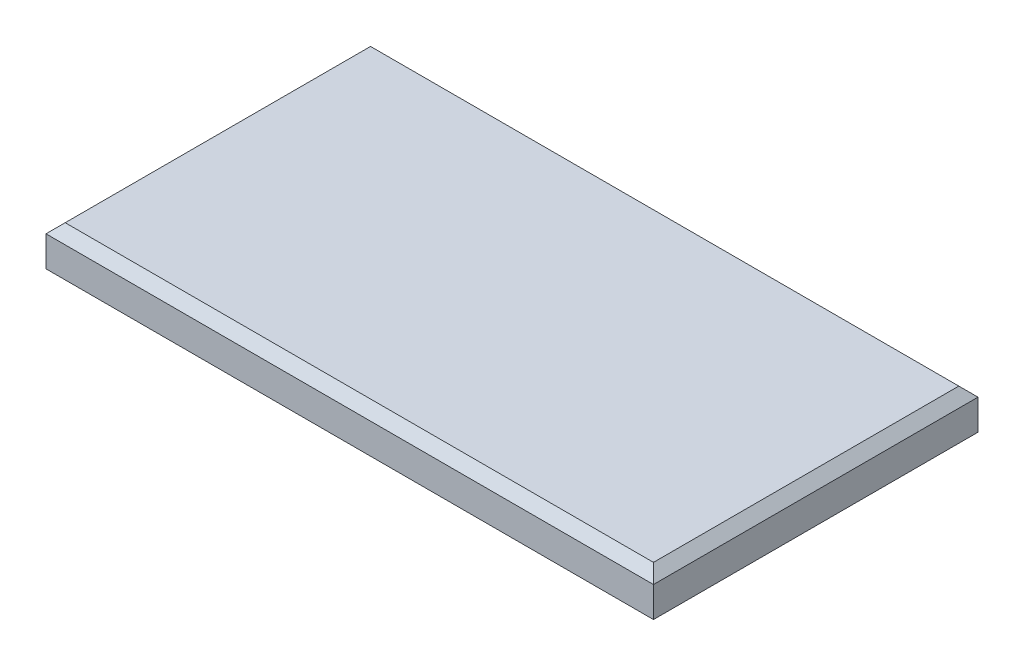
ISO-10303-21;
HEADER;
FILE_DESCRIPTION(('STEP AP214'),'2;1');
FILE_NAME('part.step','',(''),(''),'','','');
FILE_SCHEMA(('AUTOMOTIVE_DESIGN { 1 0 10303 214 1 1 1 1 }'));
ENDSEC;
DATA;
#1=APPLICATION_CONTEXT('core data for automotive mechanical design processes');
#2=APPLICATION_PROTOCOL_DEFINITION('international standard','automotive_design',2000,#1);
#3=PRODUCT_CONTEXT('',#1,'mechanical');
#4=PRODUCT('Part','Part','',(#3));
#5=PRODUCT_RELATED_PRODUCT_CATEGORY('part','',(#4));
#6=PRODUCT_DEFINITION_FORMATION('','',#4);
#7=PRODUCT_DEFINITION_CONTEXT('part definition',#1,'design');
#8=PRODUCT_DEFINITION('design','',#6,#7);
#9=PRODUCT_DEFINITION_SHAPE('','',#8);
#10=(LENGTH_UNIT() NAMED_UNIT(*) SI_UNIT(.MILLI.,.METRE.));
#11=(NAMED_UNIT(*) PLANE_ANGLE_UNIT() SI_UNIT($,.RADIAN.));
#12=(NAMED_UNIT(*) SI_UNIT($,.STERADIAN.) SOLID_ANGLE_UNIT());
#13=UNCERTAINTY_MEASURE_WITH_UNIT(LENGTH_MEASURE(1.E-05),#10,'distance_accuracy_value','');
#14=(GEOMETRIC_REPRESENTATION_CONTEXT(3) GLOBAL_UNCERTAINTY_ASSIGNED_CONTEXT((#13)) GLOBAL_UNIT_ASSIGNED_CONTEXT((#10,
#11,#12)) REPRESENTATION_CONTEXT('',''));
#15=CARTESIAN_POINT('',(0.,0.,0.));
#16=DIRECTION('',(0.,0.,1.));
#17=DIRECTION('',(1.,0.,0.));
#18=AXIS2_PLACEMENT_3D('',#15,#16,#17);
#19=CARTESIAN_POINT('',(-190.,25.,-101.5));
#20=DIRECTION('',(1.,0.,0.));
#21=DIRECTION('',(0.,0.,-1.));
#22=AXIS2_PLACEMENT_3D('',#19,#20,#21);
#23=PLANE('',#22);
#24=DIRECTION('',(0.,-1.,0.));
#25=VECTOR('',#24,1.);
#26=CARTESIAN_POINT('',(-190.,25.,101.5));
#27=LINE('',#26,#25);
#28=CARTESIAN_POINT('',(-190.,19.,101.5));
#29=VERTEX_POINT('',#28);
#30=CARTESIAN_POINT('',(-190.,0.,101.5));
#31=VERTEX_POINT('',#30);
#32=EDGE_CURVE('E87',#29,#31,#27,.T.);
#33=ORIENTED_EDGE('',*,*,#32,.F.);
#34=DIRECTION('',(0.,0.,-1.));
#35=VECTOR('',#34,1.);
#36=CARTESIAN_POINT('',(-190.,19.,-101.5));
#37=LINE('',#36,#35);
#38=CARTESIAN_POINT('',(-190.,19.,-101.5));
#39=VERTEX_POINT('',#38);
#40=EDGE_CURVE('E11',#29,#39,#37,.T.);
#41=ORIENTED_EDGE('',*,*,#40,.T.);
#42=DIRECTION('',(0.,-1.,0.));
#43=VECTOR('',#42,1.);
#44=CARTESIAN_POINT('',(-190.,25.,-101.5));
#45=LINE('',#44,#43);
#46=CARTESIAN_POINT('',(-190.,0.,-101.5));
#47=VERTEX_POINT('',#46);
#48=EDGE_CURVE('E107',#39,#47,#45,.T.);
#49=ORIENTED_EDGE('',*,*,#48,.T.);
#50=DIRECTION('',(0.,0.,1.));
#51=VECTOR('',#50,1.);
#52=CARTESIAN_POINT('',(-190.,0.,-101.5));
#53=LINE('',#52,#51);
#54=EDGE_CURVE('E102',#47,#31,#53,.T.);
#55=ORIENTED_EDGE('',*,*,#54,.T.);
#56=EDGE_LOOP('',(#33,#41,#49,#55));
#57=FACE_BOUND('',#56,.T.);
#58=ADVANCED_FACE('F34',(#57),#23,.F.);
#59=CARTESIAN_POINT('',(190.,25.,101.5));
#60=DIRECTION('',(0.,0.,-1.));
#61=DIRECTION('',(-1.,0.,0.));
#62=AXIS2_PLACEMENT_3D('',#59,#60,#61);
#63=PLANE('',#62);
#64=DIRECTION('',(0.,-1.,0.));
#65=VECTOR('',#64,1.);
#66=CARTESIAN_POINT('',(190.,25.,101.5));
#67=LINE('',#66,#65);
#68=CARTESIAN_POINT('',(190.,19.,101.5));
#69=VERTEX_POINT('',#68);
#70=CARTESIAN_POINT('',(190.,0.,101.5));
#71=VERTEX_POINT('',#70);
#72=EDGE_CURVE('E96',#69,#71,#67,.T.);
#73=ORIENTED_EDGE('',*,*,#72,.F.);
#74=DIRECTION('',(-1.,0.,0.));
#75=VECTOR('',#74,1.);
#76=CARTESIAN_POINT('',(190.,19.,101.5));
#77=LINE('',#76,#75);
#78=EDGE_CURVE('E44',#69,#29,#77,.T.);
#79=ORIENTED_EDGE('',*,*,#78,.T.);
#80=ORIENTED_EDGE('',*,*,#32,.T.);
#81=DIRECTION('',(1.,0.,0.));
#82=VECTOR('',#81,1.);
#83=CARTESIAN_POINT('',(190.,0.,101.5));
#84=LINE('',#83,#82);
#85=EDGE_CURVE('E90',#31,#71,#84,.T.);
#86=ORIENTED_EDGE('',*,*,#85,.T.);
#87=EDGE_LOOP('',(#73,#79,#80,#86));
#88=FACE_BOUND('',#87,.T.);
#89=ADVANCED_FACE('F89',(#88),#63,.F.);
#90=CARTESIAN_POINT('',(190.,25.,-101.5));
#91=DIRECTION('',(-1.,0.,0.));
#92=DIRECTION('',(0.,0.,1.));
#93=AXIS2_PLACEMENT_3D('',#90,#91,#92);
#94=PLANE('',#93);
#95=DIRECTION('',(0.,-1.,0.));
#96=VECTOR('',#95,1.);
#97=CARTESIAN_POINT('',(190.,25.,-101.5));
#98=LINE('',#97,#96);
#99=CARTESIAN_POINT('',(190.,19.,-101.5));
#100=VERTEX_POINT('',#99);
#101=CARTESIAN_POINT('',(190.,0.,-101.5));
#102=VERTEX_POINT('',#101);
#103=EDGE_CURVE('E117',#100,#102,#98,.T.);
#104=ORIENTED_EDGE('',*,*,#103,.F.);
#105=DIRECTION('',(0.,0.,1.));
#106=VECTOR('',#105,1.);
#107=CARTESIAN_POINT('',(190.,19.,-101.5));
#108=LINE('',#107,#106);
#109=EDGE_CURVE('E59',#100,#69,#108,.T.);
#110=ORIENTED_EDGE('',*,*,#109,.T.);
#111=ORIENTED_EDGE('',*,*,#72,.T.);
#112=DIRECTION('',(0.,0.,-1.));
#113=VECTOR('',#112,1.);
#114=CARTESIAN_POINT('',(190.,0.,-101.5));
#115=LINE('',#114,#113);
#116=EDGE_CURVE('E104',#71,#102,#115,.T.);
#117=ORIENTED_EDGE('',*,*,#116,.T.);
#118=EDGE_LOOP('',(#104,#110,#111,#117));
#119=FACE_BOUND('',#118,.T.);
#120=ADVANCED_FACE('F155',(#119),#94,.F.);
#121=CARTESIAN_POINT('',(190.,25.,-101.5));
#122=DIRECTION('',(0.,0.,1.));
#123=DIRECTION('',(1.,0.,0.));
#124=AXIS2_PLACEMENT_3D('',#121,#122,#123);
#125=PLANE('',#124);
#126=ORIENTED_EDGE('',*,*,#48,.F.);
#127=DIRECTION('',(1.,0.,0.));
#128=VECTOR('',#127,1.);
#129=CARTESIAN_POINT('',(190.,19.,-101.5));
#130=LINE('',#129,#128);
#131=EDGE_CURVE('E128',#39,#100,#130,.T.);
#132=ORIENTED_EDGE('',*,*,#131,.T.);
#133=ORIENTED_EDGE('',*,*,#103,.T.);
#134=DIRECTION('',(-1.,0.,0.));
#135=VECTOR('',#134,1.);
#136=CARTESIAN_POINT('',(190.,0.,-101.5));
#137=LINE('',#136,#135);
#138=EDGE_CURVE('E114',#102,#47,#137,.T.);
#139=ORIENTED_EDGE('',*,*,#138,.T.);
#140=EDGE_LOOP('',(#126,#132,#133,#139));
#141=FACE_BOUND('',#140,.T.);
#142=ADVANCED_FACE('F154',(#141),#125,.F.);
#143=CARTESIAN_POINT('',(0.,25.,0.));
#144=DIRECTION('',(0.,-1.,0.));
#145=DIRECTION('',(0.,0.,-1.));
#146=AXIS2_PLACEMENT_3D('',#143,#144,#145);
#147=PLANE('',#146);
#148=DIRECTION('',(0.,0.,-1.));
#149=VECTOR('',#148,1.);
#150=CARTESIAN_POINT('',(184.,25.,0.));
#151=LINE('',#150,#149);
#152=CARTESIAN_POINT('',(184.,25.,95.5));
#153=VERTEX_POINT('',#152);
#154=CARTESIAN_POINT('',(184.,25.,-95.5000000000001));
#155=VERTEX_POINT('',#154);
#156=EDGE_CURVE('E123',#153,#155,#151,.T.);
#157=ORIENTED_EDGE('',*,*,#156,.T.);
#158=DIRECTION('',(-1.,0.,0.));
#159=VECTOR('',#158,1.);
#160=CARTESIAN_POINT('',(0.,25.,-95.5000000000001));
#161=LINE('',#160,#159);
#162=CARTESIAN_POINT('',(-184.,25.,-95.5));
#163=VERTEX_POINT('',#162);
#164=EDGE_CURVE('E125',#155,#163,#161,.T.);
#165=ORIENTED_EDGE('',*,*,#164,.T.);
#166=DIRECTION('',(0.,0.,1.));
#167=VECTOR('',#166,1.);
#168=CARTESIAN_POINT('',(-184.,25.,0.));
#169=LINE('',#168,#167);
#170=CARTESIAN_POINT('',(-184.,25.,95.5000000000001));
#171=VERTEX_POINT('',#170);
#172=EDGE_CURVE('E95',#163,#171,#169,.T.);
#173=ORIENTED_EDGE('',*,*,#172,.T.);
#174=DIRECTION('',(1.,0.,0.));
#175=VECTOR('',#174,1.);
#176=CARTESIAN_POINT('',(0.,25.,95.5));
#177=LINE('',#176,#175);
#178=EDGE_CURVE('E121',#171,#153,#177,.T.);
#179=ORIENTED_EDGE('',*,*,#178,.T.);
#180=EDGE_LOOP('',(#157,#165,#173,#179));
#181=FACE_BOUND('',#180,.T.);
#182=ADVANCED_FACE('F147',(#181),#147,.F.);
#183=CARTESIAN_POINT('',(0.,0.,0.));
#184=DIRECTION('',(0.,-1.,0.));
#185=DIRECTION('',(0.,0.,-1.));
#186=AXIS2_PLACEMENT_3D('',#183,#184,#185);
#187=PLANE('',#186);
#188=ORIENTED_EDGE('',*,*,#54,.F.);
#189=ORIENTED_EDGE('',*,*,#138,.F.);
#190=ORIENTED_EDGE('',*,*,#116,.F.);
#191=ORIENTED_EDGE('',*,*,#85,.F.);
#192=EDGE_LOOP('',(#188,#189,#190,#191));
#193=FACE_BOUND('',#192,.T.);
#194=ADVANCED_FACE('F100',(#193),#187,.T.);
#195=CARTESIAN_POINT('',(0.,25.,95.5));
#196=DIRECTION('',(0.,-0.707106781186544,-0.707106781186551));
#197=DIRECTION('',(1.,0.,0.));
#198=AXIS2_PLACEMENT_3D('',#195,#196,#197);
#199=PLANE('',#198);
#200=DIRECTION('',(0.577350269189624,0.577350269189629,-0.577350269189624));
#201=VECTOR('',#200,1.);
#202=CARTESIAN_POINT('',(-152.166666666667,56.8333333333334,63.6666666666669));
#203=LINE('',#202,#201);
#204=EDGE_CURVE('E111',#29,#171,#203,.T.);
#205=ORIENTED_EDGE('',*,*,#204,.F.);
#206=ORIENTED_EDGE('',*,*,#78,.F.);
#207=DIRECTION('',(-0.577350269189623,0.57735026918963,-0.577350269189624));
#208=VECTOR('',#207,1.);
#209=CARTESIAN_POINT('',(122.666666666667,86.3333333333335,34.1666666666671));
#210=LINE('',#209,#208);
#211=EDGE_CURVE('E39',#153,#69,#210,.F.);
#212=ORIENTED_EDGE('',*,*,#211,.F.);
#213=ORIENTED_EDGE('',*,*,#178,.F.);
#214=EDGE_LOOP('',(#205,#206,#212,#213));
#215=FACE_BOUND('',#214,.T.);
#216=ADVANCED_FACE('F37',(#215),#199,.F.);
#217=CARTESIAN_POINT('',(184.,25.,0.));
#218=DIRECTION('',(-0.707106781186552,-0.707106781186543,0.));
#219=DIRECTION('',(0.,0.,-1.));
#220=AXIS2_PLACEMENT_3D('',#217,#218,#219);
#221=PLANE('',#220);
#222=ORIENTED_EDGE('',*,*,#211,.T.);
#223=ORIENTED_EDGE('',*,*,#109,.F.);
#224=DIRECTION('',(-0.577350269189623,0.57735026918963,0.577350269189625));
#225=VECTOR('',#224,1.);
#226=CARTESIAN_POINT('',(152.166666666667,56.8333333333335,-63.6666666666669));
#227=LINE('',#226,#225);
#228=EDGE_CURVE('E135',#155,#100,#227,.F.);
#229=ORIENTED_EDGE('',*,*,#228,.F.);
#230=ORIENTED_EDGE('',*,*,#156,.F.);
#231=EDGE_LOOP('',(#222,#223,#229,#230));
#232=FACE_BOUND('',#231,.T.);
#233=ADVANCED_FACE('F179',(#232),#221,.F.);
#234=CARTESIAN_POINT('',(-184.,25.,0.));
#235=DIRECTION('',(0.707106781186551,-0.707106781186544,0.));
#236=DIRECTION('',(0.,0.,1.));
#237=AXIS2_PLACEMENT_3D('',#234,#235,#236);
#238=PLANE('',#237);
#239=ORIENTED_EDGE('',*,*,#204,.T.);
#240=ORIENTED_EDGE('',*,*,#172,.F.);
#241=DIRECTION('',(-0.577350269189624,-0.577350269189629,-0.577350269189624));
#242=VECTOR('',#241,1.);
#243=CARTESIAN_POINT('',(-152.166666666667,56.8333333333335,-63.6666666666669));
#244=LINE('',#243,#242);
#245=EDGE_CURVE('E133',#39,#163,#244,.F.);
#246=ORIENTED_EDGE('',*,*,#245,.F.);
#247=ORIENTED_EDGE('',*,*,#40,.F.);
#248=EDGE_LOOP('',(#239,#240,#246,#247));
#249=FACE_BOUND('',#248,.T.);
#250=ADVANCED_FACE('F140',(#249),#238,.F.);
#251=CARTESIAN_POINT('',(0.,25.,-95.5000000000001));
#252=DIRECTION('',(0.,-0.707106781186544,0.707106781186551));
#253=DIRECTION('',(-1.,0.,0.));
#254=AXIS2_PLACEMENT_3D('',#251,#252,#253);
#255=PLANE('',#254);
#256=ORIENTED_EDGE('',*,*,#228,.T.);
#257=ORIENTED_EDGE('',*,*,#131,.F.);
#258=ORIENTED_EDGE('',*,*,#245,.T.);
#259=ORIENTED_EDGE('',*,*,#164,.F.);
#260=EDGE_LOOP('',(#256,#257,#258,#259));
#261=FACE_BOUND('',#260,.T.);
#262=ADVANCED_FACE('F151',(#261),#255,.F.);
#263=CLOSED_SHELL('',(#58,#89,#120,#142,#182,#194,#216,#233,#250,#262));
#264=MANIFOLD_SOLID_BREP('B2',#263);
#265=ADVANCED_BREP_SHAPE_REPRESENTATION('',(#18,#264),#14);
#266=SHAPE_DEFINITION_REPRESENTATION(#9,#265);
ENDSEC;
END-ISO-10303-21;
